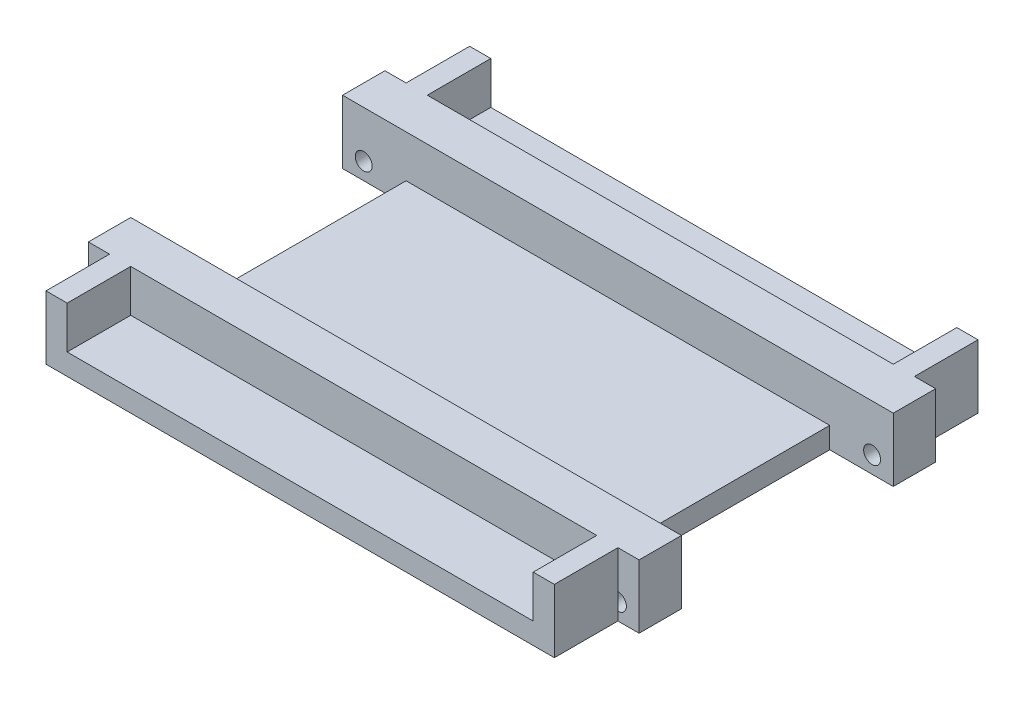
ISO-10303-21;
HEADER;
FILE_DESCRIPTION(('STEP AP214'),'2;1');
FILE_NAME('part.step','',(''),(''),'','','');
FILE_SCHEMA(('AUTOMOTIVE_DESIGN { 1 0 10303 214 1 1 1 1 }'));
ENDSEC;
DATA;
#1=APPLICATION_CONTEXT('core data for automotive mechanical design processes');
#2=APPLICATION_PROTOCOL_DEFINITION('international standard','automotive_design',2000,#1);
#3=PRODUCT_CONTEXT('',#1,'mechanical');
#4=PRODUCT('Part','Part','',(#3));
#5=PRODUCT_RELATED_PRODUCT_CATEGORY('part','',(#4));
#6=PRODUCT_DEFINITION_FORMATION('','',#4);
#7=PRODUCT_DEFINITION_CONTEXT('part definition',#1,'design');
#8=PRODUCT_DEFINITION('design','',#6,#7);
#9=PRODUCT_DEFINITION_SHAPE('','',#8);
#10=(LENGTH_UNIT() NAMED_UNIT(*) SI_UNIT(.MILLI.,.METRE.));
#11=(NAMED_UNIT(*) PLANE_ANGLE_UNIT() SI_UNIT($,.RADIAN.));
#12=(NAMED_UNIT(*) SI_UNIT($,.STERADIAN.) SOLID_ANGLE_UNIT());
#13=UNCERTAINTY_MEASURE_WITH_UNIT(LENGTH_MEASURE(1.E-05),#10,'distance_accuracy_value','');
#14=(GEOMETRIC_REPRESENTATION_CONTEXT(3) GLOBAL_UNCERTAINTY_ASSIGNED_CONTEXT((#13)) GLOBAL_UNIT_ASSIGNED_CONTEXT((#10,
#11,#12)) REPRESENTATION_CONTEXT('',''));
#15=CARTESIAN_POINT('',(0.,0.,0.));
#16=DIRECTION('',(0.,0.,1.));
#17=DIRECTION('',(1.,0.,0.));
#18=AXIS2_PLACEMENT_3D('',#15,#16,#17);
#19=CARTESIAN_POINT('',(0.,0.,-35.));
#20=DIRECTION('',(0.,0.,-1.));
#21=DIRECTION('',(-1.,0.,0.));
#22=AXIS2_PLACEMENT_3D('',#19,#20,#21);
#23=PLANE('',#22);
#24=CARTESIAN_POINT('',(60.,4.,-35.));
#25=DIRECTION('',(0.,0.,1.));
#26=DIRECTION('',(1.,0.,0.));
#27=AXIS2_PLACEMENT_3D('',#24,#25,#26);
#28=CIRCLE('',#27,2.);
#29=CARTESIAN_POINT('',(60.,2.,-35.));
#30=VERTEX_POINT('',#29);
#31=CARTESIAN_POINT('',(60.,6.,-35.));
#32=VERTEX_POINT('',#31);
#33=EDGE_CURVE('E389',#30,#32,#28,.T.);
#34=ORIENTED_EDGE('',*,*,#33,.T.);
#35=DIRECTION('',(0.,-1.,0.));
#36=VECTOR('',#35,1.);
#37=CARTESIAN_POINT('',(60.,15.,-35.));
#38=LINE('',#37,#36);
#39=CARTESIAN_POINT('',(60.,15.,-35.));
#40=VERTEX_POINT('',#39);
#41=EDGE_CURVE('E278',#40,#32,#38,.T.);
#42=ORIENTED_EDGE('',*,*,#41,.F.);
#43=DIRECTION('',(1.,0.,0.));
#44=VECTOR('',#43,1.);
#45=CARTESIAN_POINT('',(65.,15.,-35.));
#46=LINE('',#45,#44);
#47=CARTESIAN_POINT('',(65.,15.,-35.));
#48=VERTEX_POINT('',#47);
#49=EDGE_CURVE('E425',#40,#48,#46,.T.);
#50=ORIENTED_EDGE('',*,*,#49,.T.);
#51=DIRECTION('',(0.,-1.,0.));
#52=VECTOR('',#51,1.);
#53=CARTESIAN_POINT('',(65.,15.,-35.));
#54=LINE('',#53,#52);
#55=CARTESIAN_POINT('',(65.,0.,-35.));
#56=VERTEX_POINT('',#55);
#57=EDGE_CURVE('E413',#48,#56,#54,.T.);
#58=ORIENTED_EDGE('',*,*,#57,.T.);
#59=DIRECTION('',(-1.,0.,0.));
#60=VECTOR('',#59,1.);
#61=CARTESIAN_POINT('',(65.,0.,-35.));
#62=LINE('',#61,#60);
#63=CARTESIAN_POINT('',(60.,0.,-35.));
#64=VERTEX_POINT('',#63);
#65=EDGE_CURVE('E419',#56,#64,#62,.T.);
#66=ORIENTED_EDGE('',*,*,#65,.T.);
#67=DIRECTION('',(0.,-1.,0.));
#68=VECTOR('',#67,1.);
#69=CARTESIAN_POINT('',(60.,0.,-35.));
#70=LINE('',#69,#68);
#71=EDGE_CURVE('E11',#30,#64,#70,.T.);
#72=ORIENTED_EDGE('',*,*,#71,.F.);
#73=EDGE_LOOP('',(#34,#42,#50,#58,#66,#72));
#74=FACE_BOUND('',#73,.T.);
#75=ADVANCED_FACE('F45',(#74),#23,.T.);
#76=CARTESIAN_POINT('',(-55.,15.,-35.));
#77=VERTEX_POINT('',#76);
#78=CARTESIAN_POINT('',(55.,15.,-35.));
#79=VERTEX_POINT('',#78);
#80=EDGE_CURVE('E276',#77,#79,#46,.T.);
#81=ORIENTED_EDGE('',*,*,#80,.T.);
#82=DIRECTION('',(0.,-1.,0.));
#83=VECTOR('',#82,1.);
#84=CARTESIAN_POINT('',(55.,15.,-35.));
#85=LINE('',#84,#83);
#86=CARTESIAN_POINT('',(55.,5.,-35.));
#87=VERTEX_POINT('',#86);
#88=EDGE_CURVE('E265',#79,#87,#85,.T.);
#89=ORIENTED_EDGE('',*,*,#88,.T.);
#90=DIRECTION('',(1.,0.,0.));
#91=VECTOR('',#90,1.);
#92=CARTESIAN_POINT('',(60.,5.,-35.));
#93=LINE('',#92,#91);
#94=CARTESIAN_POINT('',(-55.,5.,-35.));
#95=VERTEX_POINT('',#94);
#96=EDGE_CURVE('E55',#95,#87,#93,.T.);
#97=ORIENTED_EDGE('',*,*,#96,.F.);
#98=DIRECTION('',(0.,-1.,0.));
#99=VECTOR('',#98,1.);
#100=CARTESIAN_POINT('',(-55.,15.,-35.));
#101=LINE('',#100,#99);
#102=EDGE_CURVE('E64',#77,#95,#101,.T.);
#103=ORIENTED_EDGE('',*,*,#102,.F.);
#104=EDGE_LOOP('',(#81,#89,#97,#103));
#105=FACE_BOUND('',#104,.T.);
#106=ADVANCED_FACE('F275',(#105),#23,.T.);
#107=CARTESIAN_POINT('',(60.,5.,-50.));
#108=DIRECTION('',(0.,-1.,0.));
#109=DIRECTION('',(0.,0.,-1.));
#110=AXIS2_PLACEMENT_3D('',#107,#108,#109);
#111=PLANE('',#110);
#112=DIRECTION('',(0.,0.,1.));
#113=VECTOR('',#112,1.);
#114=CARTESIAN_POINT('',(55.,5.,-50.));
#115=LINE('',#114,#113);
#116=CARTESIAN_POINT('',(55.,5.,-50.));
#117=VERTEX_POINT('',#116);
#118=EDGE_CURVE('E261',#117,#87,#115,.T.);
#119=ORIENTED_EDGE('',*,*,#118,.F.);
#120=DIRECTION('',(1.,0.,0.));
#121=VECTOR('',#120,1.);
#122=CARTESIAN_POINT('',(60.,5.,-50.));
#123=LINE('',#122,#121);
#124=CARTESIAN_POINT('',(-55.,5.,-50.));
#125=VERTEX_POINT('',#124);
#126=EDGE_CURVE('E298',#125,#117,#123,.T.);
#127=ORIENTED_EDGE('',*,*,#126,.F.);
#128=DIRECTION('',(0.,0.,-1.));
#129=VECTOR('',#128,1.);
#130=CARTESIAN_POINT('',(-55.,5.,-50.));
#131=LINE('',#130,#129);
#132=EDGE_CURVE('E272',#95,#125,#131,.T.);
#133=ORIENTED_EDGE('',*,*,#132,.F.);
#134=ORIENTED_EDGE('',*,*,#96,.T.);
#135=EDGE_LOOP('',(#119,#127,#133,#134));
#136=FACE_BOUND('',#135,.T.);
#137=ADVANCED_FACE('F280',(#136),#111,.F.);
#138=CARTESIAN_POINT('',(-65.,15.,-35.));
#139=VERTEX_POINT('',#138);
#140=CARTESIAN_POINT('',(-60.,15.,-35.));
#141=VERTEX_POINT('',#140);
#142=EDGE_CURVE('E72',#139,#141,#46,.T.);
#143=ORIENTED_EDGE('',*,*,#142,.T.);
#144=DIRECTION('',(0.,-1.,0.));
#145=VECTOR('',#144,1.);
#146=CARTESIAN_POINT('',(-60.,15.,-35.));
#147=LINE('',#146,#145);
#148=CARTESIAN_POINT('',(-60.,6.,-35.));
#149=VERTEX_POINT('',#148);
#150=EDGE_CURVE('E755',#141,#149,#147,.T.);
#151=ORIENTED_EDGE('',*,*,#150,.T.);
#152=CARTESIAN_POINT('',(-60.,4.,-35.));
#153=DIRECTION('',(0.,0.,1.));
#154=DIRECTION('',(1.,0.,0.));
#155=AXIS2_PLACEMENT_3D('',#152,#153,#154);
#156=CIRCLE('',#155,2.);
#157=CARTESIAN_POINT('',(-60.,2.,-35.));
#158=VERTEX_POINT('',#157);
#159=EDGE_CURVE('E403',#149,#158,#156,.T.);
#160=ORIENTED_EDGE('',*,*,#159,.T.);
#161=DIRECTION('',(0.,1.,0.));
#162=VECTOR('',#161,1.);
#163=CARTESIAN_POINT('',(-60.,0.,-35.));
#164=LINE('',#163,#162);
#165=CARTESIAN_POINT('',(-60.,0.,-35.));
#166=VERTEX_POINT('',#165);
#167=EDGE_CURVE('E292',#166,#158,#164,.T.);
#168=ORIENTED_EDGE('',*,*,#167,.F.);
#169=CARTESIAN_POINT('',(-65.,0.,-35.));
#170=VERTEX_POINT('',#169);
#171=EDGE_CURVE('E417',#166,#170,#62,.T.);
#172=ORIENTED_EDGE('',*,*,#171,.T.);
#173=DIRECTION('',(0.,1.,0.));
#174=VECTOR('',#173,1.);
#175=CARTESIAN_POINT('',(-65.,15.,-35.));
#176=LINE('',#175,#174);
#177=EDGE_CURVE('E422',#170,#139,#176,.T.);
#178=ORIENTED_EDGE('',*,*,#177,.T.);
#179=EDGE_LOOP('',(#143,#151,#160,#168,#172,#178));
#180=FACE_BOUND('',#179,.T.);
#181=ADVANCED_FACE('F562',(#180),#23,.T.);
#182=CARTESIAN_POINT('',(0.,0.,35.));
#183=DIRECTION('',(0.,0.,1.));
#184=DIRECTION('',(1.,0.,0.));
#185=AXIS2_PLACEMENT_3D('',#182,#183,#184);
#186=PLANE('',#185);
#187=DIRECTION('',(-1.,0.,0.));
#188=VECTOR('',#187,1.);
#189=CARTESIAN_POINT('',(-65.,15.,35.));
#190=LINE('',#189,#188);
#191=CARTESIAN_POINT('',(65.,15.,35.));
#192=VERTEX_POINT('',#191);
#193=CARTESIAN_POINT('',(60.,15.,35.));
#194=VERTEX_POINT('',#193);
#195=EDGE_CURVE('E464',#192,#194,#190,.T.);
#196=ORIENTED_EDGE('',*,*,#195,.T.);
#197=DIRECTION('',(0.,-1.,0.));
#198=VECTOR('',#197,1.);
#199=CARTESIAN_POINT('',(60.,15.,35.));
#200=LINE('',#199,#198);
#201=CARTESIAN_POINT('',(60.,6.,35.));
#202=VERTEX_POINT('',#201);
#203=EDGE_CURVE('E302',#194,#202,#200,.T.);
#204=ORIENTED_EDGE('',*,*,#203,.T.);
#205=CARTESIAN_POINT('',(60.,4.,35.));
#206=DIRECTION('',(0.,0.,1.));
#207=DIRECTION('',(1.,0.,0.));
#208=AXIS2_PLACEMENT_3D('',#205,#206,#207);
#209=CIRCLE('',#208,2.);
#210=CARTESIAN_POINT('',(60.,2.,35.));
#211=VERTEX_POINT('',#210);
#212=EDGE_CURVE('E384',#211,#202,#209,.T.);
#213=ORIENTED_EDGE('',*,*,#212,.F.);
#214=DIRECTION('',(0.,1.,0.));
#215=VECTOR('',#214,1.);
#216=CARTESIAN_POINT('',(60.,0.,35.));
#217=LINE('',#216,#215);
#218=CARTESIAN_POINT('',(60.,0.,35.));
#219=VERTEX_POINT('',#218);
#220=EDGE_CURVE('E358',#219,#211,#217,.T.);
#221=ORIENTED_EDGE('',*,*,#220,.F.);
#222=DIRECTION('',(1.,0.,0.));
#223=VECTOR('',#222,1.);
#224=CARTESIAN_POINT('',(-65.,0.,35.));
#225=LINE('',#224,#223);
#226=CARTESIAN_POINT('',(65.,0.,35.));
#227=VERTEX_POINT('',#226);
#228=EDGE_CURVE('E472',#219,#227,#225,.T.);
#229=ORIENTED_EDGE('',*,*,#228,.T.);
#230=DIRECTION('',(0.,1.,0.));
#231=VECTOR('',#230,1.);
#232=CARTESIAN_POINT('',(65.,15.,35.));
#233=LINE('',#232,#231);
#234=EDGE_CURVE('E458',#227,#192,#233,.T.);
#235=ORIENTED_EDGE('',*,*,#234,.T.);
#236=EDGE_LOOP('',(#196,#204,#213,#221,#229,#235));
#237=FACE_BOUND('',#236,.T.);
#238=ADVANCED_FACE('F569',(#237),#186,.T.);
#239=DIRECTION('',(-1.,0.,0.));
#240=VECTOR('',#239,1.);
#241=CARTESIAN_POINT('',(-60.,5.,35.));
#242=LINE('',#241,#240);
#243=CARTESIAN_POINT('',(55.,5.,35.));
#244=VERTEX_POINT('',#243);
#245=CARTESIAN_POINT('',(-55.,5.,35.));
#246=VERTEX_POINT('',#245);
#247=EDGE_CURVE('E287',#244,#246,#242,.T.);
#248=ORIENTED_EDGE('',*,*,#247,.F.);
#249=DIRECTION('',(0.,-1.,0.));
#250=VECTOR('',#249,1.);
#251=CARTESIAN_POINT('',(55.,15.,35.));
#252=LINE('',#251,#250);
#253=CARTESIAN_POINT('',(55.,15.,35.));
#254=VERTEX_POINT('',#253);
#255=EDGE_CURVE('E306',#254,#244,#252,.T.);
#256=ORIENTED_EDGE('',*,*,#255,.F.);
#257=CARTESIAN_POINT('',(-55.,15.,35.));
#258=VERTEX_POINT('',#257);
#259=EDGE_CURVE('E469',#254,#258,#190,.T.);
#260=ORIENTED_EDGE('',*,*,#259,.T.);
#261=DIRECTION('',(0.,-1.,0.));
#262=VECTOR('',#261,1.);
#263=CARTESIAN_POINT('',(-55.,15.,35.));
#264=LINE('',#263,#262);
#265=EDGE_CURVE('E345',#258,#246,#264,.T.);
#266=ORIENTED_EDGE('',*,*,#265,.T.);
#267=EDGE_LOOP('',(#248,#256,#260,#266));
#268=FACE_BOUND('',#267,.T.);
#269=ADVANCED_FACE('F574',(#268),#186,.T.);
#270=CARTESIAN_POINT('',(-60.,5.,50.));
#271=DIRECTION('',(0.,-1.,0.));
#272=DIRECTION('',(0.,0.,-1.));
#273=AXIS2_PLACEMENT_3D('',#270,#271,#272);
#274=PLANE('',#273);
#275=DIRECTION('',(0.,0.,1.));
#276=VECTOR('',#275,1.);
#277=CARTESIAN_POINT('',(55.,5.,50.));
#278=LINE('',#277,#276);
#279=CARTESIAN_POINT('',(55.,5.,50.));
#280=VERTEX_POINT('',#279);
#281=EDGE_CURVE('E313',#244,#280,#278,.T.);
#282=ORIENTED_EDGE('',*,*,#281,.F.);
#283=ORIENTED_EDGE('',*,*,#247,.T.);
#284=DIRECTION('',(0.,0.,-1.));
#285=VECTOR('',#284,1.);
#286=CARTESIAN_POINT('',(-55.,5.,50.));
#287=LINE('',#286,#285);
#288=CARTESIAN_POINT('',(-55.,5.,50.));
#289=VERTEX_POINT('',#288);
#290=EDGE_CURVE('E317',#289,#246,#287,.T.);
#291=ORIENTED_EDGE('',*,*,#290,.F.);
#292=DIRECTION('',(-1.,0.,0.));
#293=VECTOR('',#292,1.);
#294=CARTESIAN_POINT('',(-60.,5.,50.));
#295=LINE('',#294,#293);
#296=EDGE_CURVE('E364',#280,#289,#295,.T.);
#297=ORIENTED_EDGE('',*,*,#296,.F.);
#298=EDGE_LOOP('',(#282,#283,#291,#297));
#299=FACE_BOUND('',#298,.T.);
#300=ADVANCED_FACE('F614',(#299),#274,.F.);
#301=CARTESIAN_POINT('',(-60.,4.,35.));
#302=DIRECTION('',(0.,0.,1.));
#303=DIRECTION('',(1.,0.,0.));
#304=AXIS2_PLACEMENT_3D('',#301,#302,#303);
#305=CIRCLE('',#304,2.);
#306=CARTESIAN_POINT('',(-60.,6.,35.));
#307=VERTEX_POINT('',#306);
#308=CARTESIAN_POINT('',(-60.,2.,35.));
#309=VERTEX_POINT('',#308);
#310=EDGE_CURVE('E397',#307,#309,#305,.T.);
#311=ORIENTED_EDGE('',*,*,#310,.F.);
#312=DIRECTION('',(0.,-1.,0.));
#313=VECTOR('',#312,1.);
#314=CARTESIAN_POINT('',(-60.,15.,35.));
#315=LINE('',#314,#313);
#316=CARTESIAN_POINT('',(-60.,15.,35.));
#317=VERTEX_POINT('',#316);
#318=EDGE_CURVE('E338',#317,#307,#315,.T.);
#319=ORIENTED_EDGE('',*,*,#318,.F.);
#320=CARTESIAN_POINT('',(-65.,15.,35.));
#321=VERTEX_POINT('',#320);
#322=EDGE_CURVE('E462',#317,#321,#190,.T.);
#323=ORIENTED_EDGE('',*,*,#322,.T.);
#324=DIRECTION('',(0.,-1.,0.));
#325=VECTOR('',#324,1.);
#326=CARTESIAN_POINT('',(-65.,15.,35.));
#327=LINE('',#326,#325);
#328=CARTESIAN_POINT('',(-65.,0.,35.));
#329=VERTEX_POINT('',#328);
#330=EDGE_CURVE('E468',#321,#329,#327,.T.);
#331=ORIENTED_EDGE('',*,*,#330,.T.);
#332=CARTESIAN_POINT('',(-60.,0.,35.));
#333=VERTEX_POINT('',#332);
#334=EDGE_CURVE('E473',#329,#333,#225,.T.);
#335=ORIENTED_EDGE('',*,*,#334,.T.);
#336=DIRECTION('',(0.,-1.,0.));
#337=VECTOR('',#336,1.);
#338=CARTESIAN_POINT('',(-60.,0.,35.));
#339=LINE('',#338,#337);
#340=EDGE_CURVE('E283',#309,#333,#339,.T.);
#341=ORIENTED_EDGE('',*,*,#340,.F.);
#342=EDGE_LOOP('',(#311,#319,#323,#331,#335,#341));
#343=FACE_BOUND('',#342,.T.);
#344=ADVANCED_FACE('F577',(#343),#186,.T.);
#345=CARTESIAN_POINT('',(50.,5.,-25.));
#346=DIRECTION('',(-1.,0.,0.));
#347=DIRECTION('',(0.,0.,1.));
#348=AXIS2_PLACEMENT_3D('',#345,#346,#347);
#349=PLANE('',#348);
#350=DIRECTION('',(0.,0.,-1.));
#351=VECTOR('',#350,1.);
#352=CARTESIAN_POINT('',(50.,0.,-25.));
#353=LINE('',#352,#351);
#354=CARTESIAN_POINT('',(50.,0.,25.));
#355=VERTEX_POINT('',#354);
#356=CARTESIAN_POINT('',(50.,0.,-25.));
#357=VERTEX_POINT('',#356);
#358=EDGE_CURVE('E505',#355,#357,#353,.T.);
#359=ORIENTED_EDGE('',*,*,#358,.T.);
#360=DIRECTION('',(0.,-1.,0.));
#361=VECTOR('',#360,1.);
#362=CARTESIAN_POINT('',(50.,5.,-25.));
#363=LINE('',#362,#361);
#364=CARTESIAN_POINT('',(50.,5.,-25.));
#365=VERTEX_POINT('',#364);
#366=EDGE_CURVE('E376',#365,#357,#363,.T.);
#367=ORIENTED_EDGE('',*,*,#366,.F.);
#368=DIRECTION('',(0.,0.,-1.));
#369=VECTOR('',#368,1.);
#370=CARTESIAN_POINT('',(50.,5.,-25.));
#371=LINE('',#370,#369);
#372=CARTESIAN_POINT('',(50.,5.,25.));
#373=VERTEX_POINT('',#372);
#374=EDGE_CURVE('E506',#373,#365,#371,.T.);
#375=ORIENTED_EDGE('',*,*,#374,.F.);
#376=DIRECTION('',(0.,-1.,0.));
#377=VECTOR('',#376,1.);
#378=CARTESIAN_POINT('',(50.,5.,25.));
#379=LINE('',#378,#377);
#380=EDGE_CURVE('E519',#373,#355,#379,.T.);
#381=ORIENTED_EDGE('',*,*,#380,.T.);
#382=EDGE_LOOP('',(#359,#367,#375,#381));
#383=FACE_BOUND('',#382,.T.);
#384=ADVANCED_FACE('F47',(#383),#349,.F.);
#385=CARTESIAN_POINT('',(-50.,5.,-25.));
#386=DIRECTION('',(1.,0.,0.));
#387=DIRECTION('',(0.,0.,-1.));
#388=AXIS2_PLACEMENT_3D('',#385,#386,#387);
#389=PLANE('',#388);
#390=DIRECTION('',(0.,0.,1.));
#391=VECTOR('',#390,1.);
#392=CARTESIAN_POINT('',(-50.,0.,-25.));
#393=LINE('',#392,#391);
#394=CARTESIAN_POINT('',(-50.,0.,-25.));
#395=VERTEX_POINT('',#394);
#396=CARTESIAN_POINT('',(-50.,0.,25.));
#397=VERTEX_POINT('',#396);
#398=EDGE_CURVE('E510',#395,#397,#393,.T.);
#399=ORIENTED_EDGE('',*,*,#398,.T.);
#400=DIRECTION('',(0.,-1.,0.));
#401=VECTOR('',#400,1.);
#402=CARTESIAN_POINT('',(-50.,5.,25.));
#403=LINE('',#402,#401);
#404=CARTESIAN_POINT('',(-50.,5.,25.));
#405=VERTEX_POINT('',#404);
#406=EDGE_CURVE('E526',#405,#397,#403,.T.);
#407=ORIENTED_EDGE('',*,*,#406,.F.);
#408=DIRECTION('',(0.,0.,1.));
#409=VECTOR('',#408,1.);
#410=CARTESIAN_POINT('',(-50.,5.,-25.));
#411=LINE('',#410,#409);
#412=CARTESIAN_POINT('',(-50.,5.,-25.));
#413=VERTEX_POINT('',#412);
#414=EDGE_CURVE('E513',#413,#405,#411,.T.);
#415=ORIENTED_EDGE('',*,*,#414,.F.);
#416=DIRECTION('',(0.,-1.,0.));
#417=VECTOR('',#416,1.);
#418=CARTESIAN_POINT('',(-50.,5.,-25.));
#419=LINE('',#418,#417);
#420=EDGE_CURVE('E530',#413,#395,#419,.T.);
#421=ORIENTED_EDGE('',*,*,#420,.T.);
#422=EDGE_LOOP('',(#399,#407,#415,#421));
#423=FACE_BOUND('',#422,.T.);
#424=ADVANCED_FACE('F664',(#423),#389,.F.);
#425=CARTESIAN_POINT('',(0.,5.,0.));
#426=DIRECTION('',(0.,1.,0.));
#427=DIRECTION('',(0.,0.,1.));
#428=AXIS2_PLACEMENT_3D('',#425,#426,#427);
#429=PLANE('',#428);
#430=ORIENTED_EDGE('',*,*,#374,.T.);
#431=DIRECTION('',(-1.,0.,0.));
#432=VECTOR('',#431,1.);
#433=CARTESIAN_POINT('',(-50.,5.,-25.));
#434=LINE('',#433,#432);
#435=EDGE_CURVE('E509',#365,#413,#434,.T.);
#436=ORIENTED_EDGE('',*,*,#435,.T.);
#437=ORIENTED_EDGE('',*,*,#414,.T.);
#438=DIRECTION('',(1.,0.,0.));
#439=VECTOR('',#438,1.);
#440=CARTESIAN_POINT('',(-50.,5.,25.));
#441=LINE('',#440,#439);
#442=EDGE_CURVE('E516',#405,#373,#441,.T.);
#443=ORIENTED_EDGE('',*,*,#442,.T.);
#444=EDGE_LOOP('',(#430,#436,#437,#443));
#445=FACE_BOUND('',#444,.T.);
#446=ADVANCED_FACE('F661',(#445),#429,.T.);
#447=CARTESIAN_POINT('',(0.,0.,0.));
#448=DIRECTION('',(0.,1.,0.));
#449=DIRECTION('',(0.,0.,1.));
#450=AXIS2_PLACEMENT_3D('',#447,#448,#449);
#451=PLANE('',#450);
#452=ORIENTED_EDGE('',*,*,#358,.F.);
#453=DIRECTION('',(1.,0.,0.));
#454=VECTOR('',#453,1.);
#455=CARTESIAN_POINT('',(-65.,0.,25.));
#456=LINE('',#455,#454);
#457=CARTESIAN_POINT('',(65.,0.,25.));
#458=VERTEX_POINT('',#457);
#459=EDGE_CURVE('E486',#355,#458,#456,.T.);
#460=ORIENTED_EDGE('',*,*,#459,.T.);
#461=DIRECTION('',(0.,0.,-1.));
#462=VECTOR('',#461,1.);
#463=CARTESIAN_POINT('',(65.,0.,35.));
#464=LINE('',#463,#462);
#465=EDGE_CURVE('E476',#227,#458,#464,.T.);
#466=ORIENTED_EDGE('',*,*,#465,.F.);
#467=ORIENTED_EDGE('',*,*,#228,.F.);
#468=DIRECTION('',(0.,0.,-1.));
#469=VECTOR('',#468,1.);
#470=CARTESIAN_POINT('',(60.,0.,50.));
#471=LINE('',#470,#469);
#472=CARTESIAN_POINT('',(60.,0.,50.));
#473=VERTEX_POINT('',#472);
#474=EDGE_CURVE('E366',#473,#219,#471,.T.);
#475=ORIENTED_EDGE('',*,*,#474,.F.);
#476=DIRECTION('',(1.,0.,0.));
#477=VECTOR('',#476,1.);
#478=CARTESIAN_POINT('',(-60.,0.,50.));
#479=LINE('',#478,#477);
#480=CARTESIAN_POINT('',(-60.,0.,50.));
#481=VERTEX_POINT('',#480);
#482=EDGE_CURVE('E357',#481,#473,#479,.T.);
#483=ORIENTED_EDGE('',*,*,#482,.F.);
#484=DIRECTION('',(0.,0.,-1.));
#485=VECTOR('',#484,1.);
#486=CARTESIAN_POINT('',(-60.,0.,50.));
#487=LINE('',#486,#485);
#488=EDGE_CURVE('E380',#481,#333,#487,.T.);
#489=ORIENTED_EDGE('',*,*,#488,.T.);
#490=ORIENTED_EDGE('',*,*,#334,.F.);
#491=DIRECTION('',(0.,0.,-1.));
#492=VECTOR('',#491,1.);
#493=CARTESIAN_POINT('',(-65.,0.,35.));
#494=LINE('',#493,#492);
#495=CARTESIAN_POINT('',(-65.,0.,25.));
#496=VERTEX_POINT('',#495);
#497=EDGE_CURVE('E493',#329,#496,#494,.T.);
#498=ORIENTED_EDGE('',*,*,#497,.T.);
#499=EDGE_CURVE('E463',#496,#397,#456,.T.);
#500=ORIENTED_EDGE('',*,*,#499,.T.);
#501=ORIENTED_EDGE('',*,*,#398,.F.);
#502=DIRECTION('',(-1.,0.,0.));
#503=VECTOR('',#502,1.);
#504=CARTESIAN_POINT('',(65.,0.,-25.));
#505=LINE('',#504,#503);
#506=CARTESIAN_POINT('',(-65.,0.,-25.));
#507=VERTEX_POINT('',#506);
#508=EDGE_CURVE('E432',#395,#507,#505,.T.);
#509=ORIENTED_EDGE('',*,*,#508,.T.);
#510=DIRECTION('',(0.,0.,1.));
#511=VECTOR('',#510,1.);
#512=CARTESIAN_POINT('',(-65.,0.,-35.));
#513=LINE('',#512,#511);
#514=EDGE_CURVE('E449',#170,#507,#513,.T.);
#515=ORIENTED_EDGE('',*,*,#514,.F.);
#516=ORIENTED_EDGE('',*,*,#171,.F.);
#517=DIRECTION('',(0.,0.,1.));
#518=VECTOR('',#517,1.);
#519=CARTESIAN_POINT('',(-60.,0.,-50.));
#520=LINE('',#519,#518);
#521=CARTESIAN_POINT('',(-60.,0.,-50.));
#522=VERTEX_POINT('',#521);
#523=EDGE_CURVE('E293',#522,#166,#520,.T.);
#524=ORIENTED_EDGE('',*,*,#523,.F.);
#525=DIRECTION('',(-1.,0.,0.));
#526=VECTOR('',#525,1.);
#527=CARTESIAN_POINT('',(60.,0.,-50.));
#528=LINE('',#527,#526);
#529=CARTESIAN_POINT('',(60.,0.,-50.));
#530=VERTEX_POINT('',#529);
#531=EDGE_CURVE('E762',#530,#522,#528,.T.);
#532=ORIENTED_EDGE('',*,*,#531,.F.);
#533=DIRECTION('',(0.,0.,1.));
#534=VECTOR('',#533,1.);
#535=CARTESIAN_POINT('',(60.,0.,-50.));
#536=LINE('',#535,#534);
#537=EDGE_CURVE('E297',#530,#64,#536,.T.);
#538=ORIENTED_EDGE('',*,*,#537,.T.);
#539=ORIENTED_EDGE('',*,*,#65,.F.);
#540=DIRECTION('',(0.,0.,1.));
#541=VECTOR('',#540,1.);
#542=CARTESIAN_POINT('',(65.,0.,-35.));
#543=LINE('',#542,#541);
#544=CARTESIAN_POINT('',(65.,0.,-25.));
#545=VERTEX_POINT('',#544);
#546=EDGE_CURVE('E453',#56,#545,#543,.T.);
#547=ORIENTED_EDGE('',*,*,#546,.T.);
#548=EDGE_CURVE('E433',#545,#357,#505,.T.);
#549=ORIENTED_EDGE('',*,*,#548,.T.);
#550=EDGE_LOOP('',(#452,#460,#466,#467,#475,#483,#489,#490,#498,#500,#501,#509,#515,#516,#524,
#532,#538,#539,#547,#549));
#551=FACE_BOUND('',#550,.T.);
#552=ADVANCED_FACE('F651',(#551),#451,.F.);
#553=CARTESIAN_POINT('',(65.,15.,35.));
#554=DIRECTION('',(-1.,0.,0.));
#555=DIRECTION('',(0.,0.,1.));
#556=AXIS2_PLACEMENT_3D('',#553,#554,#555);
#557=PLANE('',#556);
#558=DIRECTION('',(0.,1.,0.));
#559=VECTOR('',#558,1.);
#560=CARTESIAN_POINT('',(65.,15.,25.));
#561=LINE('',#560,#559);
#562=CARTESIAN_POINT('',(65.,15.,25.));
#563=VERTEX_POINT('',#562);
#564=EDGE_CURVE('E457',#458,#563,#561,.T.);
#565=ORIENTED_EDGE('',*,*,#564,.T.);
#566=DIRECTION('',(0.,0.,-1.));
#567=VECTOR('',#566,1.);
#568=CARTESIAN_POINT('',(65.,15.,35.));
#569=LINE('',#568,#567);
#570=EDGE_CURVE('E501',#192,#563,#569,.T.);
#571=ORIENTED_EDGE('',*,*,#570,.F.);
#572=ORIENTED_EDGE('',*,*,#234,.F.);
#573=ORIENTED_EDGE('',*,*,#465,.T.);
#574=EDGE_LOOP('',(#565,#571,#572,#573));
#575=FACE_BOUND('',#574,.T.);
#576=ADVANCED_FACE('F678',(#575),#557,.F.);
#577=CARTESIAN_POINT('',(-65.,15.,35.));
#578=DIRECTION('',(0.,-1.,0.));
#579=DIRECTION('',(0.,0.,-1.));
#580=AXIS2_PLACEMENT_3D('',#577,#578,#579);
#581=PLANE('',#580);
#582=DIRECTION('',(-1.,0.,0.));
#583=VECTOR('',#582,1.);
#584=CARTESIAN_POINT('',(-65.,15.,25.));
#585=LINE('',#584,#583);
#586=CARTESIAN_POINT('',(-65.,15.,25.));
#587=VERTEX_POINT('',#586);
#588=EDGE_CURVE('E480',#563,#587,#585,.T.);
#589=ORIENTED_EDGE('',*,*,#588,.T.);
#590=DIRECTION('',(0.,0.,-1.));
#591=VECTOR('',#590,1.);
#592=CARTESIAN_POINT('',(-65.,15.,35.));
#593=LINE('',#592,#591);
#594=EDGE_CURVE('E497',#321,#587,#593,.T.);
#595=ORIENTED_EDGE('',*,*,#594,.F.);
#596=ORIENTED_EDGE('',*,*,#322,.F.);
#597=DIRECTION('',(0.,0.,1.));
#598=VECTOR('',#597,1.);
#599=CARTESIAN_POINT('',(-60.,15.,50.));
#600=LINE('',#599,#598);
#601=CARTESIAN_POINT('',(-60.,15.,50.));
#602=VERTEX_POINT('',#601);
#603=EDGE_CURVE('E327',#317,#602,#600,.T.);
#604=ORIENTED_EDGE('',*,*,#603,.T.);
#605=DIRECTION('',(1.,0.,0.));
#606=VECTOR('',#605,1.);
#607=CARTESIAN_POINT('',(-60.,15.,50.));
#608=LINE('',#607,#606);
#609=CARTESIAN_POINT('',(-55.,15.,50.));
#610=VERTEX_POINT('',#609);
#611=EDGE_CURVE('E331',#602,#610,#608,.T.);
#612=ORIENTED_EDGE('',*,*,#611,.T.);
#613=DIRECTION('',(0.,0.,-1.));
#614=VECTOR('',#613,1.);
#615=CARTESIAN_POINT('',(-55.,15.,50.));
#616=LINE('',#615,#614);
#617=EDGE_CURVE('E334',#610,#258,#616,.T.);
#618=ORIENTED_EDGE('',*,*,#617,.T.);
#619=ORIENTED_EDGE('',*,*,#259,.F.);
#620=DIRECTION('',(0.,0.,1.));
#621=VECTOR('',#620,1.);
#622=CARTESIAN_POINT('',(55.,15.,50.));
#623=LINE('',#622,#621);
#624=CARTESIAN_POINT('',(55.,15.,50.));
#625=VERTEX_POINT('',#624);
#626=EDGE_CURVE('E322',#254,#625,#623,.T.);
#627=ORIENTED_EDGE('',*,*,#626,.T.);
#628=DIRECTION('',(1.,0.,0.));
#629=VECTOR('',#628,1.);
#630=CARTESIAN_POINT('',(60.,15.,50.));
#631=LINE('',#630,#629);
#632=CARTESIAN_POINT('',(60.,15.,50.));
#633=VERTEX_POINT('',#632);
#634=EDGE_CURVE('E312',#625,#633,#631,.T.);
#635=ORIENTED_EDGE('',*,*,#634,.T.);
#636=DIRECTION('',(0.,0.,-1.));
#637=VECTOR('',#636,1.);
#638=CARTESIAN_POINT('',(60.,15.,50.));
#639=LINE('',#638,#637);
#640=EDGE_CURVE('E318',#633,#194,#639,.T.);
#641=ORIENTED_EDGE('',*,*,#640,.T.);
#642=ORIENTED_EDGE('',*,*,#195,.F.);
#643=ORIENTED_EDGE('',*,*,#570,.T.);
#644=EDGE_LOOP('',(#589,#595,#596,#604,#612,#618,#619,#627,#635,#641,#642,#643));
#645=FACE_BOUND('',#644,.T.);
#646=ADVANCED_FACE('F675',(#645),#581,.F.);
#647=CARTESIAN_POINT('',(-65.,15.,35.));
#648=DIRECTION('',(1.,0.,0.));
#649=DIRECTION('',(0.,0.,-1.));
#650=AXIS2_PLACEMENT_3D('',#647,#648,#649);
#651=PLANE('',#650);
#652=DIRECTION('',(0.,-1.,0.));
#653=VECTOR('',#652,1.);
#654=CARTESIAN_POINT('',(-65.,15.,25.));
#655=LINE('',#654,#653);
#656=EDGE_CURVE('E483',#587,#496,#655,.T.);
#657=ORIENTED_EDGE('',*,*,#656,.T.);
#658=ORIENTED_EDGE('',*,*,#497,.F.);
#659=ORIENTED_EDGE('',*,*,#330,.F.);
#660=ORIENTED_EDGE('',*,*,#594,.T.);
#661=EDGE_LOOP('',(#657,#658,#659,#660));
#662=FACE_BOUND('',#661,.T.);
#663=ADVANCED_FACE('F638',(#662),#651,.F.);
#664=CARTESIAN_POINT('',(0.,0.,25.));
#665=DIRECTION('',(0.,0.,1.));
#666=DIRECTION('',(1.,0.,0.));
#667=AXIS2_PLACEMENT_3D('',#664,#665,#666);
#668=PLANE('',#667);
#669=CARTESIAN_POINT('',(60.,4.,25.));
#670=DIRECTION('',(0.,0.,1.));
#671=DIRECTION('',(1.,0.,0.));
#672=AXIS2_PLACEMENT_3D('',#669,#670,#671);
#673=CIRCLE('',#672,2.);
#674=CARTESIAN_POINT('',(62.,4.,25.));
#675=VERTEX_POINT('',#674);
#676=EDGE_CURVE('E393',#675,#675,#673,.T.);
#677=ORIENTED_EDGE('',*,*,#676,.T.);
#678=EDGE_LOOP('',(#677));
#679=FACE_BOUND('',#678,.T.);
#680=CARTESIAN_POINT('',(-60.,4.,25.));
#681=DIRECTION('',(0.,0.,1.));
#682=DIRECTION('',(1.,0.,0.));
#683=AXIS2_PLACEMENT_3D('',#680,#681,#682);
#684=CIRCLE('',#683,2.);
#685=CARTESIAN_POINT('',(-58.,4.,25.));
#686=VERTEX_POINT('',#685);
#687=EDGE_CURVE('E408',#686,#686,#684,.T.);
#688=ORIENTED_EDGE('',*,*,#687,.T.);
#689=EDGE_LOOP('',(#688));
#690=FACE_BOUND('',#689,.T.);
#691=ORIENTED_EDGE('',*,*,#380,.F.);
#692=ORIENTED_EDGE('',*,*,#442,.F.);
#693=ORIENTED_EDGE('',*,*,#406,.T.);
#694=ORIENTED_EDGE('',*,*,#499,.F.);
#695=ORIENTED_EDGE('',*,*,#656,.F.);
#696=ORIENTED_EDGE('',*,*,#588,.F.);
#697=ORIENTED_EDGE('',*,*,#564,.F.);
#698=ORIENTED_EDGE('',*,*,#459,.F.);
#699=EDGE_LOOP('',(#691,#692,#693,#694,#695,#696,#697,#698));
#700=FACE_BOUND('',#699,.T.);
#701=ADVANCED_FACE('F634',(#679,#690,#700),#668,.F.);
#702=CARTESIAN_POINT('',(65.,15.,-35.));
#703=DIRECTION('',(-1.,0.,0.));
#704=DIRECTION('',(0.,0.,1.));
#705=AXIS2_PLACEMENT_3D('',#702,#703,#704);
#706=PLANE('',#705);
#707=DIRECTION('',(0.,-1.,0.));
#708=VECTOR('',#707,1.);
#709=CARTESIAN_POINT('',(65.,15.,-25.));
#710=LINE('',#709,#708);
#711=CARTESIAN_POINT('',(65.,15.,-25.));
#712=VERTEX_POINT('',#711);
#713=EDGE_CURVE('E412',#712,#545,#710,.T.);
#714=ORIENTED_EDGE('',*,*,#713,.T.);
#715=ORIENTED_EDGE('',*,*,#546,.F.);
#716=ORIENTED_EDGE('',*,*,#57,.F.);
#717=DIRECTION('',(0.,0.,1.));
#718=VECTOR('',#717,1.);
#719=CARTESIAN_POINT('',(65.,15.,-35.));
#720=LINE('',#719,#718);
#721=EDGE_CURVE('E428',#48,#712,#720,.T.);
#722=ORIENTED_EDGE('',*,*,#721,.T.);
#723=EDGE_LOOP('',(#714,#715,#716,#722));
#724=FACE_BOUND('',#723,.T.);
#725=ADVANCED_FACE('F637',(#724),#706,.F.);
#726=CARTESIAN_POINT('',(-65.,15.,-35.));
#727=DIRECTION('',(1.,0.,0.));
#728=DIRECTION('',(0.,0.,-1.));
#729=AXIS2_PLACEMENT_3D('',#726,#727,#728);
#730=PLANE('',#729);
#731=DIRECTION('',(0.,1.,0.));
#732=VECTOR('',#731,1.);
#733=CARTESIAN_POINT('',(-65.,15.,-25.));
#734=LINE('',#733,#732);
#735=CARTESIAN_POINT('',(-65.,15.,-25.));
#736=VERTEX_POINT('',#735);
#737=EDGE_CURVE('E437',#507,#736,#734,.T.);
#738=ORIENTED_EDGE('',*,*,#737,.T.);
#739=DIRECTION('',(0.,0.,1.));
#740=VECTOR('',#739,1.);
#741=CARTESIAN_POINT('',(-65.,15.,-35.));
#742=LINE('',#741,#740);
#743=EDGE_CURVE('E445',#139,#736,#742,.T.);
#744=ORIENTED_EDGE('',*,*,#743,.F.);
#745=ORIENTED_EDGE('',*,*,#177,.F.);
#746=ORIENTED_EDGE('',*,*,#514,.T.);
#747=EDGE_LOOP('',(#738,#744,#745,#746));
#748=FACE_BOUND('',#747,.T.);
#749=ADVANCED_FACE('F718',(#748),#730,.F.);
#750=CARTESIAN_POINT('',(65.,15.,-35.));
#751=DIRECTION('',(0.,-1.,0.));
#752=DIRECTION('',(0.,0.,-1.));
#753=AXIS2_PLACEMENT_3D('',#750,#751,#752);
#754=PLANE('',#753);
#755=DIRECTION('',(1.,0.,0.));
#756=VECTOR('',#755,1.);
#757=CARTESIAN_POINT('',(65.,15.,-25.));
#758=LINE('',#757,#756);
#759=EDGE_CURVE('E418',#736,#712,#758,.T.);
#760=ORIENTED_EDGE('',*,*,#759,.T.);
#761=ORIENTED_EDGE('',*,*,#721,.F.);
#762=ORIENTED_EDGE('',*,*,#49,.F.);
#763=DIRECTION('',(0.,0.,-1.));
#764=VECTOR('',#763,1.);
#765=CARTESIAN_POINT('',(60.,15.,-50.));
#766=LINE('',#765,#764);
#767=CARTESIAN_POINT('',(60.,15.,-50.));
#768=VERTEX_POINT('',#767);
#769=EDGE_CURVE('E273',#40,#768,#766,.T.);
#770=ORIENTED_EDGE('',*,*,#769,.T.);
#771=DIRECTION('',(-1.,0.,0.));
#772=VECTOR('',#771,1.);
#773=CARTESIAN_POINT('',(60.,15.,-50.));
#774=LINE('',#773,#772);
#775=CARTESIAN_POINT('',(55.,15.,-50.));
#776=VERTEX_POINT('',#775);
#777=EDGE_CURVE('E729',#768,#776,#774,.T.);
#778=ORIENTED_EDGE('',*,*,#777,.T.);
#779=DIRECTION('',(0.,0.,1.));
#780=VECTOR('',#779,1.);
#781=CARTESIAN_POINT('',(55.,15.,-50.));
#782=LINE('',#781,#780);
#783=EDGE_CURVE('E733',#776,#79,#782,.T.);
#784=ORIENTED_EDGE('',*,*,#783,.T.);
#785=ORIENTED_EDGE('',*,*,#80,.F.);
#786=DIRECTION('',(0.,0.,-1.));
#787=VECTOR('',#786,1.);
#788=CARTESIAN_POINT('',(-55.,15.,-50.));
#789=LINE('',#788,#787);
#790=CARTESIAN_POINT('',(-55.,15.,-50.));
#791=VERTEX_POINT('',#790);
#792=EDGE_CURVE('E740',#77,#791,#789,.T.);
#793=ORIENTED_EDGE('',*,*,#792,.T.);
#794=DIRECTION('',(-1.,0.,0.));
#795=VECTOR('',#794,1.);
#796=CARTESIAN_POINT('',(-60.,15.,-50.));
#797=LINE('',#796,#795);
#798=CARTESIAN_POINT('',(-60.,15.,-50.));
#799=VERTEX_POINT('',#798);
#800=EDGE_CURVE('E743',#791,#799,#797,.T.);
#801=ORIENTED_EDGE('',*,*,#800,.T.);
#802=DIRECTION('',(0.,0.,1.));
#803=VECTOR('',#802,1.);
#804=CARTESIAN_POINT('',(-60.,15.,-50.));
#805=LINE('',#804,#803);
#806=EDGE_CURVE('E737',#799,#141,#805,.T.);
#807=ORIENTED_EDGE('',*,*,#806,.T.);
#808=ORIENTED_EDGE('',*,*,#142,.F.);
#809=ORIENTED_EDGE('',*,*,#743,.T.);
#810=EDGE_LOOP('',(#760,#761,#762,#770,#778,#784,#785,#793,#801,#807,#808,#809));
#811=FACE_BOUND('',#810,.T.);
#812=ADVANCED_FACE('F555',(#811),#754,.F.);
#813=CARTESIAN_POINT('',(0.,0.,-25.));
#814=DIRECTION('',(0.,0.,-1.));
#815=DIRECTION('',(-1.,0.,0.));
#816=AXIS2_PLACEMENT_3D('',#813,#814,#815);
#817=PLANE('',#816);
#818=CARTESIAN_POINT('',(60.,4.,-25.));
#819=DIRECTION('',(0.,0.,-1.));
#820=DIRECTION('',(-1.,0.,0.));
#821=AXIS2_PLACEMENT_3D('',#818,#819,#820);
#822=CIRCLE('',#821,2.);
#823=CARTESIAN_POINT('',(58.,4.,-25.));
#824=VERTEX_POINT('',#823);
#825=EDGE_CURVE('E49',#824,#824,#822,.T.);
#826=ORIENTED_EDGE('',*,*,#825,.T.);
#827=EDGE_LOOP('',(#826));
#828=FACE_BOUND('',#827,.T.);
#829=CARTESIAN_POINT('',(-60.,4.,-25.));
#830=DIRECTION('',(0.,0.,-1.));
#831=DIRECTION('',(-1.,0.,0.));
#832=AXIS2_PLACEMENT_3D('',#829,#830,#831);
#833=CIRCLE('',#832,2.);
#834=CARTESIAN_POINT('',(-62.,4.,-25.));
#835=VERTEX_POINT('',#834);
#836=EDGE_CURVE('E402',#835,#835,#833,.T.);
#837=ORIENTED_EDGE('',*,*,#836,.T.);
#838=EDGE_LOOP('',(#837));
#839=FACE_BOUND('',#838,.T.);
#840=ORIENTED_EDGE('',*,*,#420,.F.);
#841=ORIENTED_EDGE('',*,*,#435,.F.);
#842=ORIENTED_EDGE('',*,*,#366,.T.);
#843=ORIENTED_EDGE('',*,*,#548,.F.);
#844=ORIENTED_EDGE('',*,*,#713,.F.);
#845=ORIENTED_EDGE('',*,*,#759,.F.);
#846=ORIENTED_EDGE('',*,*,#737,.F.);
#847=ORIENTED_EDGE('',*,*,#508,.F.);
#848=EDGE_LOOP('',(#840,#841,#842,#843,#844,#845,#846,#847));
#849=FACE_BOUND('',#848,.T.);
#850=ADVANCED_FACE('F539',(#828,#839,#849),#817,.F.);
#851=CARTESIAN_POINT('',(-60.,4.,-35.));
#852=DIRECTION('',(0.,0.,1.));
#853=DIRECTION('',(1.,0.,0.));
#854=AXIS2_PLACEMENT_3D('',#851,#852,#853);
#855=CYLINDRICAL_SURFACE('',#854,2.);
#856=EDGE_CURVE('E398',#158,#149,#156,.T.);
#857=ORIENTED_EDGE('',*,*,#856,.F.);
#858=ORIENTED_EDGE('',*,*,#159,.F.);
#859=EDGE_LOOP('',(#857,#858));
#860=FACE_BOUND('',#859,.T.);
#861=ORIENTED_EDGE('',*,*,#836,.F.);
#862=EDGE_LOOP('',(#861));
#863=FACE_BOUND('',#862,.T.);
#864=ADVANCED_FACE('F542',(#860,#863),#855,.F.);
#865=EDGE_CURVE('E404',#309,#307,#305,.T.);
#866=ORIENTED_EDGE('',*,*,#865,.T.);
#867=ORIENTED_EDGE('',*,*,#310,.T.);
#868=EDGE_LOOP('',(#866,#867));
#869=FACE_BOUND('',#868,.T.);
#870=ORIENTED_EDGE('',*,*,#687,.F.);
#871=EDGE_LOOP('',(#870));
#872=FACE_BOUND('',#871,.T.);
#873=ADVANCED_FACE('F544',(#869,#872),#855,.F.);
#874=CARTESIAN_POINT('',(60.,4.,-35.));
#875=DIRECTION('',(0.,0.,1.));
#876=DIRECTION('',(1.,0.,0.));
#877=AXIS2_PLACEMENT_3D('',#874,#875,#876);
#878=CYLINDRICAL_SURFACE('',#877,2.);
#879=EDGE_CURVE('E385',#32,#30,#28,.T.);
#880=ORIENTED_EDGE('',*,*,#879,.F.);
#881=ORIENTED_EDGE('',*,*,#33,.F.);
#882=EDGE_LOOP('',(#880,#881));
#883=FACE_BOUND('',#882,.T.);
#884=ORIENTED_EDGE('',*,*,#825,.F.);
#885=EDGE_LOOP('',(#884));
#886=FACE_BOUND('',#885,.T.);
#887=ADVANCED_FACE('F552',(#883,#886),#878,.F.);
#888=EDGE_CURVE('E390',#202,#211,#209,.T.);
#889=ORIENTED_EDGE('',*,*,#888,.T.);
#890=ORIENTED_EDGE('',*,*,#212,.T.);
#891=EDGE_LOOP('',(#889,#890));
#892=FACE_BOUND('',#891,.T.);
#893=ORIENTED_EDGE('',*,*,#676,.F.);
#894=EDGE_LOOP('',(#893));
#895=FACE_BOUND('',#894,.T.);
#896=ADVANCED_FACE('F612',(#892,#895),#878,.F.);
#897=CARTESIAN_POINT('',(0.,0.,35.));
#898=DIRECTION('',(0.,0.,-1.));
#899=DIRECTION('',(-1.,0.,0.));
#900=AXIS2_PLACEMENT_3D('',#897,#898,#899);
#901=PLANE('',#900);
#902=ORIENTED_EDGE('',*,*,#888,.F.);
#903=EDGE_CURVE('E370',#211,#202,#217,.T.);
#904=ORIENTED_EDGE('',*,*,#903,.F.);
#905=EDGE_LOOP('',(#902,#904));
#906=FACE_BOUND('',#905,.T.);
#907=ADVANCED_FACE('F608',(#906),#901,.T.);
#908=ORIENTED_EDGE('',*,*,#865,.F.);
#909=EDGE_CURVE('E289',#307,#309,#339,.T.);
#910=ORIENTED_EDGE('',*,*,#909,.F.);
#911=EDGE_LOOP('',(#908,#910));
#912=FACE_BOUND('',#911,.T.);
#913=ADVANCED_FACE('F611',(#912),#901,.T.);
#914=CARTESIAN_POINT('',(-60.,0.,50.));
#915=DIRECTION('',(1.,0.,0.));
#916=DIRECTION('',(0.,0.,-1.));
#917=AXIS2_PLACEMENT_3D('',#914,#915,#916);
#918=PLANE('',#917);
#919=ORIENTED_EDGE('',*,*,#909,.T.);
#920=ORIENTED_EDGE('',*,*,#340,.T.);
#921=ORIENTED_EDGE('',*,*,#488,.F.);
#922=DIRECTION('',(0.,-1.,0.));
#923=VECTOR('',#922,1.);
#924=CARTESIAN_POINT('',(-60.,0.,50.));
#925=LINE('',#924,#923);
#926=EDGE_CURVE('E353',#602,#481,#925,.T.);
#927=ORIENTED_EDGE('',*,*,#926,.F.);
#928=ORIENTED_EDGE('',*,*,#603,.F.);
#929=ORIENTED_EDGE('',*,*,#318,.T.);
#930=EDGE_LOOP('',(#919,#920,#921,#927,#928,#929));
#931=FACE_BOUND('',#930,.T.);
#932=ADVANCED_FACE('F620',(#931),#918,.F.);
#933=CARTESIAN_POINT('',(60.,0.,50.));
#934=DIRECTION('',(-1.,0.,0.));
#935=DIRECTION('',(0.,-1.,0.));
#936=AXIS2_PLACEMENT_3D('',#933,#934,#935);
#937=PLANE('',#936);
#938=ORIENTED_EDGE('',*,*,#220,.T.);
#939=ORIENTED_EDGE('',*,*,#903,.T.);
#940=ORIENTED_EDGE('',*,*,#203,.F.);
#941=ORIENTED_EDGE('',*,*,#640,.F.);
#942=DIRECTION('',(0.,1.,0.));
#943=VECTOR('',#942,1.);
#944=CARTESIAN_POINT('',(60.,0.,50.));
#945=LINE('',#944,#943);
#946=EDGE_CURVE('E361',#473,#633,#945,.T.);
#947=ORIENTED_EDGE('',*,*,#946,.F.);
#948=ORIENTED_EDGE('',*,*,#474,.T.);
#949=EDGE_LOOP('',(#938,#939,#940,#941,#947,#948));
#950=FACE_BOUND('',#949,.T.);
#951=ADVANCED_FACE('F606',(#950),#937,.F.);
#952=CARTESIAN_POINT('',(0.,0.,50.));
#953=DIRECTION('',(0.,0.,-1.));
#954=DIRECTION('',(-1.,0.,0.));
#955=AXIS2_PLACEMENT_3D('',#952,#953,#954);
#956=PLANE('',#955);
#957=ORIENTED_EDGE('',*,*,#926,.T.);
#958=ORIENTED_EDGE('',*,*,#482,.T.);
#959=ORIENTED_EDGE('',*,*,#946,.T.);
#960=ORIENTED_EDGE('',*,*,#634,.F.);
#961=DIRECTION('',(0.,-1.,0.));
#962=VECTOR('',#961,1.);
#963=CARTESIAN_POINT('',(55.,15.,50.));
#964=LINE('',#963,#962);
#965=EDGE_CURVE('E309',#625,#280,#964,.T.);
#966=ORIENTED_EDGE('',*,*,#965,.T.);
#967=ORIENTED_EDGE('',*,*,#296,.T.);
#968=DIRECTION('',(0.,-1.,0.));
#969=VECTOR('',#968,1.);
#970=CARTESIAN_POINT('',(-55.,15.,50.));
#971=LINE('',#970,#969);
#972=EDGE_CURVE('E349',#610,#289,#971,.T.);
#973=ORIENTED_EDGE('',*,*,#972,.F.);
#974=ORIENTED_EDGE('',*,*,#611,.F.);
#975=EDGE_LOOP('',(#957,#958,#959,#960,#966,#967,#973,#974));
#976=FACE_BOUND('',#975,.T.);
#977=ADVANCED_FACE('F602',(#976),#956,.F.);
#978=CARTESIAN_POINT('',(-55.,15.,50.));
#979=DIRECTION('',(-1.,0.,0.));
#980=DIRECTION('',(0.,0.,1.));
#981=AXIS2_PLACEMENT_3D('',#978,#979,#980);
#982=PLANE('',#981);
#983=ORIENTED_EDGE('',*,*,#290,.T.);
#984=ORIENTED_EDGE('',*,*,#265,.F.);
#985=ORIENTED_EDGE('',*,*,#617,.F.);
#986=ORIENTED_EDGE('',*,*,#972,.T.);
#987=EDGE_LOOP('',(#983,#984,#985,#986));
#988=FACE_BOUND('',#987,.T.);
#989=ADVANCED_FACE('F598',(#988),#982,.F.);
#990=CARTESIAN_POINT('',(55.,15.,50.));
#991=DIRECTION('',(1.,0.,0.));
#992=DIRECTION('',(0.,0.,-1.));
#993=AXIS2_PLACEMENT_3D('',#990,#991,#992);
#994=PLANE('',#993);
#995=ORIENTED_EDGE('',*,*,#281,.T.);
#996=ORIENTED_EDGE('',*,*,#965,.F.);
#997=ORIENTED_EDGE('',*,*,#626,.F.);
#998=ORIENTED_EDGE('',*,*,#255,.T.);
#999=EDGE_LOOP('',(#995,#996,#997,#998));
#1000=FACE_BOUND('',#999,.T.);
#1001=ADVANCED_FACE('F595',(#1000),#994,.F.);
#1002=CARTESIAN_POINT('',(0.,0.,-35.));
#1003=DIRECTION('',(0.,0.,1.));
#1004=DIRECTION('',(1.,0.,0.));
#1005=AXIS2_PLACEMENT_3D('',#1002,#1003,#1004);
#1006=PLANE('',#1005);
#1007=EDGE_CURVE('E57',#32,#30,#70,.T.);
#1008=ORIENTED_EDGE('',*,*,#1007,.F.);
#1009=ORIENTED_EDGE('',*,*,#879,.T.);
#1010=EDGE_LOOP('',(#1008,#1009));
#1011=FACE_BOUND('',#1010,.T.);
#1012=ADVANCED_FACE('F593',(#1011),#1006,.T.);
#1013=CARTESIAN_POINT('',(60.,0.,-50.));
#1014=DIRECTION('',(-1.,0.,0.));
#1015=DIRECTION('',(0.,0.,1.));
#1016=AXIS2_PLACEMENT_3D('',#1013,#1014,#1015);
#1017=PLANE('',#1016);
#1018=ORIENTED_EDGE('',*,*,#1007,.T.);
#1019=ORIENTED_EDGE('',*,*,#71,.T.);
#1020=ORIENTED_EDGE('',*,*,#537,.F.);
#1021=DIRECTION('',(0.,-1.,0.));
#1022=VECTOR('',#1021,1.);
#1023=CARTESIAN_POINT('',(60.,0.,-50.));
#1024=LINE('',#1023,#1022);
#1025=EDGE_CURVE('E758',#768,#530,#1024,.T.);
#1026=ORIENTED_EDGE('',*,*,#1025,.F.);
#1027=ORIENTED_EDGE('',*,*,#769,.F.);
#1028=ORIENTED_EDGE('',*,*,#41,.T.);
#1029=EDGE_LOOP('',(#1018,#1019,#1020,#1026,#1027,#1028));
#1030=FACE_BOUND('',#1029,.T.);
#1031=ADVANCED_FACE('F589',(#1030),#1017,.F.);
#1032=CARTESIAN_POINT('',(-60.,0.,-50.));
#1033=DIRECTION('',(1.,0.,0.));
#1034=DIRECTION('',(0.,0.,-1.));
#1035=AXIS2_PLACEMENT_3D('',#1032,#1033,#1034);
#1036=PLANE('',#1035);
#1037=ORIENTED_EDGE('',*,*,#167,.T.);
#1038=EDGE_CURVE('E771',#158,#149,#164,.T.);
#1039=ORIENTED_EDGE('',*,*,#1038,.T.);
#1040=ORIENTED_EDGE('',*,*,#150,.F.);
#1041=ORIENTED_EDGE('',*,*,#806,.F.);
#1042=DIRECTION('',(0.,1.,0.));
#1043=VECTOR('',#1042,1.);
#1044=CARTESIAN_POINT('',(-60.,0.,-50.));
#1045=LINE('',#1044,#1043);
#1046=EDGE_CURVE('E765',#522,#799,#1045,.T.);
#1047=ORIENTED_EDGE('',*,*,#1046,.F.);
#1048=ORIENTED_EDGE('',*,*,#523,.T.);
#1049=EDGE_LOOP('',(#1037,#1039,#1040,#1041,#1047,#1048));
#1050=FACE_BOUND('',#1049,.T.);
#1051=ADVANCED_FACE('F585',(#1050),#1036,.F.);
#1052=CARTESIAN_POINT('',(0.,0.,-50.));
#1053=DIRECTION('',(0.,0.,1.));
#1054=DIRECTION('',(1.,0.,0.));
#1055=AXIS2_PLACEMENT_3D('',#1052,#1053,#1054);
#1056=PLANE('',#1055);
#1057=ORIENTED_EDGE('',*,*,#1025,.T.);
#1058=ORIENTED_EDGE('',*,*,#531,.T.);
#1059=ORIENTED_EDGE('',*,*,#1046,.T.);
#1060=ORIENTED_EDGE('',*,*,#800,.F.);
#1061=DIRECTION('',(0.,-1.,0.));
#1062=VECTOR('',#1061,1.);
#1063=CARTESIAN_POINT('',(-55.,15.,-50.));
#1064=LINE('',#1063,#1062);
#1065=EDGE_CURVE('E747',#791,#125,#1064,.T.);
#1066=ORIENTED_EDGE('',*,*,#1065,.T.);
#1067=ORIENTED_EDGE('',*,*,#126,.T.);
#1068=DIRECTION('',(0.,-1.,0.));
#1069=VECTOR('',#1068,1.);
#1070=CARTESIAN_POINT('',(55.,15.,-50.));
#1071=LINE('',#1070,#1069);
#1072=EDGE_CURVE('E267',#776,#117,#1071,.T.);
#1073=ORIENTED_EDGE('',*,*,#1072,.F.);
#1074=ORIENTED_EDGE('',*,*,#777,.F.);
#1075=EDGE_LOOP('',(#1057,#1058,#1059,#1060,#1066,#1067,#1073,#1074));
#1076=FACE_BOUND('',#1075,.T.);
#1077=ADVANCED_FACE('F588',(#1076),#1056,.F.);
#1078=ORIENTED_EDGE('',*,*,#1038,.F.);
#1079=ORIENTED_EDGE('',*,*,#856,.T.);
#1080=EDGE_LOOP('',(#1078,#1079));
#1081=FACE_BOUND('',#1080,.T.);
#1082=ADVANCED_FACE('F583',(#1081),#1006,.T.);
#1083=CARTESIAN_POINT('',(-55.,15.,-50.));
#1084=DIRECTION('',(-1.,0.,0.));
#1085=DIRECTION('',(0.,0.,1.));
#1086=AXIS2_PLACEMENT_3D('',#1083,#1084,#1085);
#1087=PLANE('',#1086);
#1088=ORIENTED_EDGE('',*,*,#132,.T.);
#1089=ORIENTED_EDGE('',*,*,#1065,.F.);
#1090=ORIENTED_EDGE('',*,*,#792,.F.);
#1091=ORIENTED_EDGE('',*,*,#102,.T.);
#1092=EDGE_LOOP('',(#1088,#1089,#1090,#1091));
#1093=FACE_BOUND('',#1092,.T.);
#1094=ADVANCED_FACE('F788',(#1093),#1087,.F.);
#1095=CARTESIAN_POINT('',(55.,15.,-50.));
#1096=DIRECTION('',(1.,0.,0.));
#1097=DIRECTION('',(0.,0.,-1.));
#1098=AXIS2_PLACEMENT_3D('',#1095,#1096,#1097);
#1099=PLANE('',#1098);
#1100=ORIENTED_EDGE('',*,*,#118,.T.);
#1101=ORIENTED_EDGE('',*,*,#88,.F.);
#1102=ORIENTED_EDGE('',*,*,#783,.F.);
#1103=ORIENTED_EDGE('',*,*,#1072,.T.);
#1104=EDGE_LOOP('',(#1100,#1101,#1102,#1103));
#1105=FACE_BOUND('',#1104,.T.);
#1106=ADVANCED_FACE('F263',(#1105),#1099,.F.);
#1107=CLOSED_SHELL('',(#75,#106,#137,#181,#238,#269,#300,#344,#384,#424,#446,#552,#576,#646,
#663,#701,#725,#749,#812,#850,#864,#873,#887,#896,#907,#913,#932,#951,#977,#989,#1001,#1012,
#1031,#1051,#1077,#1082,#1094,#1106));
#1108=MANIFOLD_SOLID_BREP('B2',#1107);
#1109=ADVANCED_BREP_SHAPE_REPRESENTATION('',(#18,#1108),#14);
#1110=SHAPE_DEFINITION_REPRESENTATION(#9,#1109);
ENDSEC;
END-ISO-10303-21;
